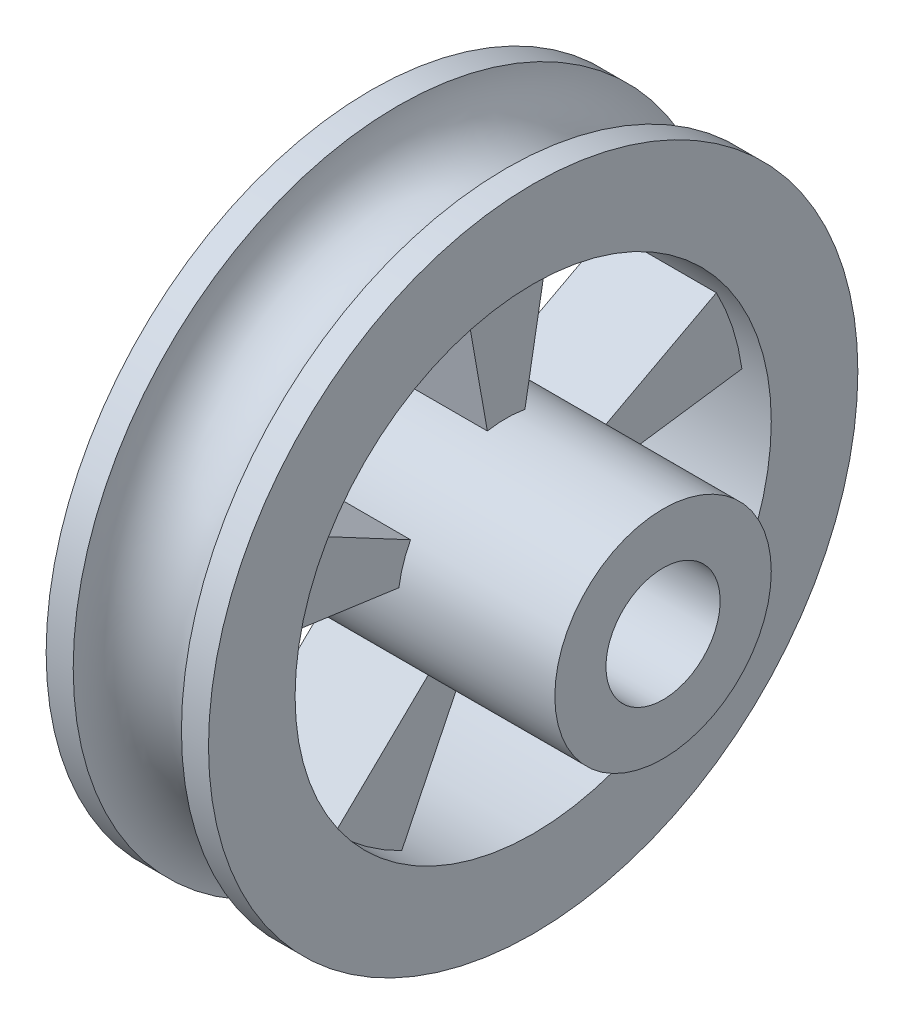
ISO-10303-21;
HEADER;
FILE_DESCRIPTION(('STEP AP214'),'2;1');
FILE_NAME('part.step','',(''),(''),'','','');
FILE_SCHEMA(('AUTOMOTIVE_DESIGN { 1 0 10303 214 1 1 1 1 }'));
ENDSEC;
DATA;
#1=APPLICATION_CONTEXT('core data for automotive mechanical design processes');
#2=APPLICATION_PROTOCOL_DEFINITION('international standard','automotive_design',2000,#1);
#3=PRODUCT_CONTEXT('',#1,'mechanical');
#4=PRODUCT('Part','Part','',(#3));
#5=PRODUCT_RELATED_PRODUCT_CATEGORY('part','',(#4));
#6=PRODUCT_DEFINITION_FORMATION('','',#4);
#7=PRODUCT_DEFINITION_CONTEXT('part definition',#1,'design');
#8=PRODUCT_DEFINITION('design','',#6,#7);
#9=PRODUCT_DEFINITION_SHAPE('','',#8);
#10=(LENGTH_UNIT() NAMED_UNIT(*) SI_UNIT(.MILLI.,.METRE.));
#11=(NAMED_UNIT(*) PLANE_ANGLE_UNIT() SI_UNIT($,.RADIAN.));
#12=(NAMED_UNIT(*) SI_UNIT($,.STERADIAN.) SOLID_ANGLE_UNIT());
#13=UNCERTAINTY_MEASURE_WITH_UNIT(LENGTH_MEASURE(1.E-05),#10,'distance_accuracy_value','');
#14=(GEOMETRIC_REPRESENTATION_CONTEXT(3) GLOBAL_UNCERTAINTY_ASSIGNED_CONTEXT((#13)) GLOBAL_UNIT_ASSIGNED_CONTEXT((#10,
#11,#12)) REPRESENTATION_CONTEXT('',''));
#15=CARTESIAN_POINT('',(0.,0.,0.));
#16=DIRECTION('',(0.,0.,1.));
#17=DIRECTION('',(1.,0.,0.));
#18=AXIS2_PLACEMENT_3D('',#15,#16,#17);
#19=CARTESIAN_POINT('',(-4.7625,0.,0.));
#20=DIRECTION('',(1.,0.,0.));
#21=DIRECTION('',(0.,0.,-1.));
#22=AXIS2_PLACEMENT_3D('',#19,#20,#21);
#23=CYLINDRICAL_SURFACE('',#22,9.525);
#24=CARTESIAN_POINT('',(-0.793749999999999,0.,0.));
#25=DIRECTION('',(-1.,0.,0.));
#26=DIRECTION('',(0.,0.,1.));
#27=AXIS2_PLACEMENT_3D('',#24,#25,#26);
#28=CIRCLE('',#27,9.525);
#29=CARTESIAN_POINT('',(-0.793749999999999,0.,-9.525));
#30=VERTEX_POINT('',#29);
#31=EDGE_CURVE('E47',#30,#30,#28,.F.);
#32=CARTESIAN_POINT('',(0.,0.,0.));
#33=DIRECTION('',(-1.,0.,0.));
#34=DIRECTION('',(0.,0.,1.));
#35=AXIS2_PLACEMENT_3D('',#32,#33,#34);
#36=CIRCLE('',#35,9.525);
#37=CARTESIAN_POINT('',(0.,0.,-9.525));
#38=VERTEX_POINT('',#37);
#39=EDGE_CURVE('E318',#38,#38,#36,.T.);
#40=CARTESIAN_POINT('',(-0.793749999999999,0.,-9.525));
#41=CARTESIAN_POINT('',(-0.785481770833333,0.,-9.525));
#42=CARTESIAN_POINT('',(-0.777213541666666,0.,-9.525));
#43=CARTESIAN_POINT('',(-0.760677083333333,0.,-9.525));
#44=CARTESIAN_POINT('',(-0.752408854166666,0.,-9.525));
#45=CARTESIAN_POINT('',(-0.735872395833333,0.,-9.525));
#46=CARTESIAN_POINT('',(-0.727604166666666,0.,-9.525));
#47=CARTESIAN_POINT('',(-0.711067708333333,0.,-9.525));
#48=CARTESIAN_POINT('',(-0.702799479166666,0.,-9.525));
#49=CARTESIAN_POINT('',(-0.686263020833333,0.,-9.525));
#50=CARTESIAN_POINT('',(-0.677994791666666,0.,-9.525));
#51=CARTESIAN_POINT('',(-0.661458333333333,0.,-9.525));
#52=CARTESIAN_POINT('',(-0.653190104166666,0.,-9.525));
#53=CARTESIAN_POINT('',(-0.636653645833333,0.,-9.525));
#54=CARTESIAN_POINT('',(-0.628385416666666,0.,-9.525));
#55=CARTESIAN_POINT('',(-0.611848958333333,0.,-9.525));
#56=CARTESIAN_POINT('',(-0.603580729166666,0.,-9.525));
#57=CARTESIAN_POINT('',(-0.587044270833333,0.,-9.525));
#58=CARTESIAN_POINT('',(-0.578776041666666,0.,-9.525));
#59=CARTESIAN_POINT('',(-0.562239583333333,0.,-9.525));
#60=CARTESIAN_POINT('',(-0.553971354166666,0.,-9.525));
#61=CARTESIAN_POINT('',(-0.537434895833333,0.,-9.525));
#62=CARTESIAN_POINT('',(-0.529166666666666,0.,-9.525));
#63=CARTESIAN_POINT('',(-0.512630208333333,0.,-9.525));
#64=CARTESIAN_POINT('',(-0.504361979166666,0.,-9.525));
#65=CARTESIAN_POINT('',(-0.487825520833333,0.,-9.525));
#66=CARTESIAN_POINT('',(-0.479557291666666,0.,-9.525));
#67=CARTESIAN_POINT('',(-0.463020833333333,0.,-9.525));
#68=CARTESIAN_POINT('',(-0.454752604166666,0.,-9.525));
#69=CARTESIAN_POINT('',(-0.438216145833333,0.,-9.525));
#70=CARTESIAN_POINT('',(-0.429947916666666,0.,-9.525));
#71=CARTESIAN_POINT('',(-0.413411458333333,0.,-9.525));
#72=CARTESIAN_POINT('',(-0.405143229166666,0.,-9.525));
#73=CARTESIAN_POINT('',(-0.388606770833333,0.,-9.525));
#74=CARTESIAN_POINT('',(-0.380338541666666,0.,-9.525));
#75=CARTESIAN_POINT('',(-0.363802083333333,0.,-9.525));
#76=CARTESIAN_POINT('',(-0.355533854166666,0.,-9.525));
#77=CARTESIAN_POINT('',(-0.338997395833333,0.,-9.525));
#78=CARTESIAN_POINT('',(-0.330729166666666,0.,-9.525));
#79=CARTESIAN_POINT('',(-0.314192708333333,0.,-9.525));
#80=CARTESIAN_POINT('',(-0.305924479166667,0.,-9.525));
#81=CARTESIAN_POINT('',(-0.289388020833333,0.,-9.525));
#82=CARTESIAN_POINT('',(-0.281119791666667,0.,-9.525));
#83=CARTESIAN_POINT('',(-0.264583333333333,0.,-9.525));
#84=CARTESIAN_POINT('',(-0.256315104166666,0.,-9.525));
#85=CARTESIAN_POINT('',(-0.239778645833333,0.,-9.525));
#86=CARTESIAN_POINT('',(-0.231510416666667,0.,-9.525));
#87=CARTESIAN_POINT('',(-0.214973958333333,0.,-9.525));
#88=CARTESIAN_POINT('',(-0.206705729166667,0.,-9.525));
#89=CARTESIAN_POINT('',(-0.190169270833333,0.,-9.525));
#90=CARTESIAN_POINT('',(-0.181901041666666,0.,-9.525));
#91=CARTESIAN_POINT('',(-0.165364583333333,0.,-9.525));
#92=CARTESIAN_POINT('',(-0.157096354166667,0.,-9.525));
#93=CARTESIAN_POINT('',(-0.140559895833333,0.,-9.525));
#94=CARTESIAN_POINT('',(-0.132291666666667,0.,-9.525));
#95=CARTESIAN_POINT('',(-0.115755208333333,0.,-9.525));
#96=CARTESIAN_POINT('',(-0.107486979166666,0.,-9.525));
#97=CARTESIAN_POINT('',(-0.090950520833333,0.,-9.525));
#98=CARTESIAN_POINT('',(-0.0826822916666665,0.,-9.525));
#99=CARTESIAN_POINT('',(-0.0661458333333333,0.,-9.525));
#100=CARTESIAN_POINT('',(-0.0578776041666665,0.,-9.525));
#101=CARTESIAN_POINT('',(-0.0413411458333333,0.,-9.525));
#102=CARTESIAN_POINT('',(-0.0330729166666668,0.,-9.525));
#103=CARTESIAN_POINT('',(-0.0165364583333335,0.,-9.525));
#104=CARTESIAN_POINT('',(-0.00826822916666677,0.,-9.525));
#105=CARTESIAN_POINT('',(0.,0.,-9.525));
#106=B_SPLINE_CURVE_WITH_KNOTS('',3,(#40,#41,#42,#43,#44,#45,#46,#47,#48,#49,#50,#51,#52,#53,
#54,#55,#56,#57,#58,#59,#60,#61,#62,#63,#64,#65,#66,#67,#68,#69,#70,#71,#72,#73,#74,#75,#76,#77,
#78,#79,#80,#81,#82,#83,#84,#85,#86,#87,#88,#89,#90,#91,#92,#93,#94,#95,#96,#97,#98,#99,#100,
#101,#102,#103,#104,#105),.UNSPECIFIED.,.F.,.F.,(4,2,2,2,2,2,2,2,2,2,2,2,2,2,2,2,2,2,2,2,2,2,2,
2,2,2,2,2,2,2,2,2,4),(0.,0.0248046875000003,0.0496093749999997,0.0744140625,0.0992187499999995,
0.1240234375,0.148828125,0.1736328125,0.1984375,0.2232421875,0.248046875,0.2728515625,
0.29765625,0.3224609375,0.347265625,0.372070312499999,0.396875,0.4216796875,0.446484374999999,
0.4712890625,0.496093749999999,0.520898437499999,0.545703125,0.570507812499999,
0.595312499999999,0.6201171875,0.644921874999999,0.6697265625,0.69453125,0.719335937499999,
0.744140625,0.768945312499999,0.793749999999999),.UNSPECIFIED.);
#107=EDGE_CURVE('BSEAM43',#30,#38,#106,.T.);
#108=ORIENTED_EDGE('',*,*,#31,.T.);
#109=ORIENTED_EDGE('',*,*,#39,.T.);
#110=ORIENTED_EDGE('',*,*,#107,.T.);
#111=ORIENTED_EDGE('',*,*,#107,.F.);
#112=EDGE_LOOP('',(#108,#110,#109,#111));
#113=FACE_BOUND('',#112,.T.);
#114=ADVANCED_FACE('F43',(#113),#23,.T.);
#115=CARTESIAN_POINT('',(3.81,0.,0.));
#116=DIRECTION('',(-1.,0.,0.));
#117=DIRECTION('',(0.,0.,1.));
#118=AXIS2_PLACEMENT_3D('',#115,#116,#117);
#119=CYLINDRICAL_SURFACE('',#118,3.175);
#120=DIRECTION('',(-1.,0.,0.));
#121=VECTOR('',#120,1.);
#122=CARTESIAN_POINT('',(3.81,0.441874595548242,3.14410111825448));
#123=LINE('',#122,#121);
#124=CARTESIAN_POINT('',(-0.79375,0.441874595548242,3.14410111825448));
#125=VERTEX_POINT('',#124);
#126=CARTESIAN_POINT('',(-3.96875,0.441874595548242,3.14410111825448));
#127=VERTEX_POINT('',#126);
#128=EDGE_CURVE('E65',#125,#127,#123,.T.);
#129=ORIENTED_EDGE('',*,*,#128,.T.);
#130=CARTESIAN_POINT('',(-3.96875,0.,0.));
#131=DIRECTION('',(-1.,0.,0.));
#132=DIRECTION('',(0.,0.,1.));
#133=AXIS2_PLACEMENT_3D('',#130,#131,#132);
#134=CIRCLE('',#133,3.175);
#135=CARTESIAN_POINT('',(-3.96875,1.49057221184524,2.80335860732707));
#136=VERTEX_POINT('',#135);
#137=EDGE_CURVE('E60',#127,#136,#134,.T.);
#138=ORIENTED_EDGE('',*,*,#137,.T.);
#139=DIRECTION('',(-1.,0.,0.));
#140=VECTOR('',#139,1.);
#141=CARTESIAN_POINT('',(3.81,1.49057221184524,2.80335860732707));
#142=LINE('',#141,#140);
#143=CARTESIAN_POINT('',(-0.79375,1.49057221184524,2.80335860732707));
#144=VERTEX_POINT('',#143);
#145=EDGE_CURVE('E218',#136,#144,#142,.F.);
#146=ORIENTED_EDGE('',*,*,#145,.T.);
#147=CARTESIAN_POINT('',(-0.79375,0.,0.));
#148=DIRECTION('',(-1.,0.,0.));
#149=DIRECTION('',(0.,0.,1.));
#150=AXIS2_PLACEMENT_3D('',#147,#148,#149);
#151=CIRCLE('',#150,3.175);
#152=EDGE_CURVE('E197',#125,#144,#151,.T.);
#153=ORIENTED_EDGE('',*,*,#152,.F.);
#154=EDGE_LOOP('',(#129,#138,#146,#153));
#155=FACE_BOUND('',#154,.T.);
#156=DIRECTION('',(-1.,0.,0.));
#157=VECTOR('',#156,1.);
#158=CARTESIAN_POINT('',(3.81,-2.85367109699984,1.39182839105534));
#159=LINE('',#158,#157);
#160=CARTESIAN_POINT('',(-0.79375,-2.85367109699984,1.39182839105534));
#161=VERTEX_POINT('',#160);
#162=CARTESIAN_POINT('',(-3.96875,-2.85367109699984,1.39182839105534));
#163=VERTEX_POINT('',#162);
#164=EDGE_CURVE('E247',#161,#163,#159,.T.);
#165=ORIENTED_EDGE('',*,*,#164,.T.);
#166=CARTESIAN_POINT('',(-3.96875,0.,0.));
#167=DIRECTION('',(-1.,0.,0.));
#168=DIRECTION('',(0.,0.,1.));
#169=AXIS2_PLACEMENT_3D('',#166,#167,#168);
#170=CIRCLE('',#169,3.175);
#171=CARTESIAN_POINT('',(-3.96875,-2.20554032620729,2.28390386607524));
#172=VERTEX_POINT('',#171);
#173=EDGE_CURVE('E245',#163,#172,#170,.T.);
#174=ORIENTED_EDGE('',*,*,#173,.T.);
#175=DIRECTION('',(-1.,0.,0.));
#176=VECTOR('',#175,1.);
#177=CARTESIAN_POINT('',(3.81,-2.20554032620729,2.28390386607524));
#178=LINE('',#177,#176);
#179=CARTESIAN_POINT('',(-0.79375,-2.20554032620729,2.28390386607524));
#180=VERTEX_POINT('',#179);
#181=EDGE_CURVE('E249',#172,#180,#178,.F.);
#182=ORIENTED_EDGE('',*,*,#181,.T.);
#183=CARTESIAN_POINT('',(-0.79375,0.,0.));
#184=DIRECTION('',(-1.,0.,0.));
#185=DIRECTION('',(0.,0.,1.));
#186=AXIS2_PLACEMENT_3D('',#183,#184,#185);
#187=CIRCLE('',#186,3.175);
#188=EDGE_CURVE('E242',#161,#180,#187,.T.);
#189=ORIENTED_EDGE('',*,*,#188,.F.);
#190=EDGE_LOOP('',(#165,#174,#182,#189));
#191=FACE_BOUND('',#190,.T.);
#192=DIRECTION('',(-1.,0.,0.));
#193=VECTOR('',#192,1.);
#194=CARTESIAN_POINT('',(3.81,-2.20554032620733,-2.2839038660752));
#195=LINE('',#194,#193);
#196=CARTESIAN_POINT('',(-0.79375,-2.20554032620733,-2.28390386607521));
#197=VERTEX_POINT('',#196);
#198=CARTESIAN_POINT('',(-3.96875,-2.20554032620733,-2.2839038660752));
#199=VERTEX_POINT('',#198);
#200=EDGE_CURVE('E278',#197,#199,#195,.T.);
#201=ORIENTED_EDGE('',*,*,#200,.T.);
#202=CARTESIAN_POINT('',(-3.96875,0.,0.));
#203=DIRECTION('',(-1.,0.,0.));
#204=DIRECTION('',(0.,0.,1.));
#205=AXIS2_PLACEMENT_3D('',#202,#203,#204);
#206=CIRCLE('',#205,3.175);
#207=CARTESIAN_POINT('',(-3.96875,-2.85367109699986,-1.3918283910553));
#208=VERTEX_POINT('',#207);
#209=EDGE_CURVE('E276',#199,#208,#206,.T.);
#210=ORIENTED_EDGE('',*,*,#209,.T.);
#211=DIRECTION('',(-1.,0.,0.));
#212=VECTOR('',#211,1.);
#213=CARTESIAN_POINT('',(3.81,-2.85367109699986,-1.3918283910553));
#214=LINE('',#213,#212);
#215=CARTESIAN_POINT('',(-0.79375,-2.85367109699986,-1.3918283910553));
#216=VERTEX_POINT('',#215);
#217=EDGE_CURVE('E280',#208,#216,#214,.F.);
#218=ORIENTED_EDGE('',*,*,#217,.T.);
#219=CARTESIAN_POINT('',(-0.79375,0.,0.));
#220=DIRECTION('',(-1.,0.,0.));
#221=DIRECTION('',(0.,0.,1.));
#222=AXIS2_PLACEMENT_3D('',#219,#220,#221);
#223=CIRCLE('',#222,3.175);
#224=EDGE_CURVE('E255',#197,#216,#223,.T.);
#225=ORIENTED_EDGE('',*,*,#224,.F.);
#226=EDGE_LOOP('',(#201,#210,#218,#225));
#227=FACE_BOUND('',#226,.T.);
#228=DIRECTION('',(-1.,0.,0.));
#229=VECTOR('',#228,1.);
#230=CARTESIAN_POINT('',(3.81,1.4905722118452,-2.8033586073271));
#231=LINE('',#230,#229);
#232=CARTESIAN_POINT('',(-0.79375,1.4905722118452,-2.8033586073271));
#233=VERTEX_POINT('',#232);
#234=CARTESIAN_POINT('',(-3.96875,1.4905722118452,-2.8033586073271));
#235=VERTEX_POINT('',#234);
#236=EDGE_CURVE('E309',#233,#235,#231,.T.);
#237=ORIENTED_EDGE('',*,*,#236,.T.);
#238=CARTESIAN_POINT('',(-3.96875,0.,0.));
#239=DIRECTION('',(-1.,0.,0.));
#240=DIRECTION('',(0.,0.,1.));
#241=AXIS2_PLACEMENT_3D('',#238,#239,#240);
#242=CIRCLE('',#241,3.175);
#243=CARTESIAN_POINT('',(-3.96875,0.441874595548196,-3.14410111825449));
#244=VERTEX_POINT('',#243);
#245=EDGE_CURVE('E307',#235,#244,#242,.T.);
#246=ORIENTED_EDGE('',*,*,#245,.T.);
#247=DIRECTION('',(-1.,0.,0.));
#248=VECTOR('',#247,1.);
#249=CARTESIAN_POINT('',(3.81,0.441874595548196,-3.14410111825449));
#250=LINE('',#249,#248);
#251=CARTESIAN_POINT('',(-0.79375,0.441874595548196,-3.14410111825449));
#252=VERTEX_POINT('',#251);
#253=EDGE_CURVE('E311',#244,#252,#250,.F.);
#254=ORIENTED_EDGE('',*,*,#253,.T.);
#255=CARTESIAN_POINT('',(-0.79375,0.,0.));
#256=DIRECTION('',(-1.,0.,0.));
#257=DIRECTION('',(0.,0.,1.));
#258=AXIS2_PLACEMENT_3D('',#255,#256,#257);
#259=CIRCLE('',#258,3.175);
#260=EDGE_CURVE('E304',#233,#252,#259,.T.);
#261=ORIENTED_EDGE('',*,*,#260,.F.);
#262=EDGE_LOOP('',(#237,#246,#254,#261));
#263=FACE_BOUND('',#262,.T.);
#264=DIRECTION('',(-1.,0.,0.));
#265=VECTOR('',#264,1.);
#266=CARTESIAN_POINT('',(3.81,3.12676461581376,0.551332964092505));
#267=LINE('',#266,#265);
#268=CARTESIAN_POINT('',(-0.79375,3.12676461581376,0.551332964092505));
#269=VERTEX_POINT('',#268);
#270=CARTESIAN_POINT('',(-3.96875,3.12676461581376,0.551332964092505));
#271=VERTEX_POINT('',#270);
#272=EDGE_CURVE('E357',#269,#271,#267,.T.);
#273=ORIENTED_EDGE('',*,*,#272,.T.);
#274=CARTESIAN_POINT('',(-3.96875,0.,0.));
#275=DIRECTION('',(-1.,0.,0.));
#276=DIRECTION('',(0.,0.,1.));
#277=AXIS2_PLACEMENT_3D('',#274,#275,#276);
#278=CIRCLE('',#277,3.175);
#279=CARTESIAN_POINT('',(-3.96875,3.12676461581376,-0.551332964092507));
#280=VERTEX_POINT('',#279);
#281=EDGE_CURVE('E13',#271,#280,#278,.T.);
#282=ORIENTED_EDGE('',*,*,#281,.T.);
#283=DIRECTION('',(-1.,0.,0.));
#284=VECTOR('',#283,1.);
#285=CARTESIAN_POINT('',(3.81,3.12676461581376,-0.551332964092507));
#286=LINE('',#285,#284);
#287=CARTESIAN_POINT('',(-0.79375,3.12676461581376,-0.551332964092507));
#288=VERTEX_POINT('',#287);
#289=EDGE_CURVE('E52',#280,#288,#286,.F.);
#290=ORIENTED_EDGE('',*,*,#289,.T.);
#291=CARTESIAN_POINT('',(-0.79375,0.,0.));
#292=DIRECTION('',(-1.,0.,0.));
#293=DIRECTION('',(0.,0.,1.));
#294=AXIS2_PLACEMENT_3D('',#291,#292,#293);
#295=CIRCLE('',#294,3.175);
#296=EDGE_CURVE('E354',#269,#288,#295,.T.);
#297=ORIENTED_EDGE('',*,*,#296,.F.);
#298=EDGE_LOOP('',(#273,#282,#290,#297));
#299=FACE_BOUND('',#298,.T.);
#300=CARTESIAN_POINT('',(3.81,0.,0.));
#301=DIRECTION('',(1.,0.,0.));
#302=DIRECTION('',(0.,0.,-1.));
#303=AXIS2_PLACEMENT_3D('',#300,#301,#302);
#304=CIRCLE('',#303,3.175);
#305=CARTESIAN_POINT('',(3.81,0.,-3.175));
#306=VERTEX_POINT('',#305);
#307=EDGE_CURVE('E351',#306,#306,#304,.T.);
#308=ORIENTED_EDGE('',*,*,#307,.F.);
#309=EDGE_LOOP('',(#308));
#310=FACE_BOUND('',#309,.T.);
#311=CARTESIAN_POINT('',(-4.7625,0.,0.));
#312=DIRECTION('',(-1.,0.,0.));
#313=DIRECTION('',(0.,0.,1.));
#314=AXIS2_PLACEMENT_3D('',#311,#312,#313);
#315=CIRCLE('',#314,3.175);
#316=CARTESIAN_POINT('',(-4.7625,0.,3.175));
#317=VERTEX_POINT('',#316);
#318=EDGE_CURVE('E348',#317,#317,#315,.T.);
#319=ORIENTED_EDGE('',*,*,#318,.F.);
#320=EDGE_LOOP('',(#319));
#321=FACE_BOUND('',#320,.T.);
#322=ADVANCED_FACE('F45',(#155,#191,#227,#263,#299,#310,#321),#119,.T.);
#323=CARTESIAN_POINT('',(3.81,0.,0.));
#324=DIRECTION('',(1.,0.,0.));
#325=DIRECTION('',(0.,0.,-1.));
#326=AXIS2_PLACEMENT_3D('',#323,#324,#325);
#327=PLANE('',#326);
#328=CARTESIAN_POINT('',(3.81,0.,0.));
#329=DIRECTION('',(-1.,0.,0.));
#330=DIRECTION('',(0.,0.,1.));
#331=AXIS2_PLACEMENT_3D('',#328,#329,#330);
#332=CIRCLE('',#331,1.675);
#333=CARTESIAN_POINT('',(3.81,0.,1.675));
#334=VERTEX_POINT('',#333);
#335=EDGE_CURVE('E361',#334,#334,#332,.T.);
#336=ORIENTED_EDGE('',*,*,#335,.T.);
#337=EDGE_LOOP('',(#336));
#338=FACE_BOUND('',#337,.T.);
#339=ORIENTED_EDGE('',*,*,#307,.T.);
#340=EDGE_LOOP('',(#339));
#341=FACE_BOUND('',#340,.T.);
#342=ADVANCED_FACE('F379',(#338,#341),#327,.T.);
#343=CARTESIAN_POINT('',(-4.7625,0.,0.));
#344=DIRECTION('',(-1.,0.,0.));
#345=DIRECTION('',(0.,0.,1.));
#346=AXIS2_PLACEMENT_3D('',#343,#344,#345);
#347=PLANE('',#346);
#348=CARTESIAN_POINT('',(-4.7625,0.,0.));
#349=DIRECTION('',(-1.,0.,0.));
#350=DIRECTION('',(0.,0.,1.));
#351=AXIS2_PLACEMENT_3D('',#348,#349,#350);
#352=CIRCLE('',#351,1.675);
#353=CARTESIAN_POINT('',(-4.7625,0.,1.675));
#354=VERTEX_POINT('',#353);
#355=EDGE_CURVE('E366',#354,#354,#352,.T.);
#356=ORIENTED_EDGE('',*,*,#355,.F.);
#357=EDGE_LOOP('',(#356));
#358=FACE_BOUND('',#357,.T.);
#359=ORIENTED_EDGE('',*,*,#318,.T.);
#360=EDGE_LOOP('',(#359));
#361=FACE_BOUND('',#360,.T.);
#362=ADVANCED_FACE('F375',(#358,#361),#347,.T.);
#363=CARTESIAN_POINT('',(7.39425765050365,0.,0.));
#364=DIRECTION('',(0.,-0.173648177666931,-0.984807753012208));
#365=DIRECTION('',(0.,0.984807753012208,-0.173648177666931));
#366=AXIS2_PLACEMENT_3D('',#363,#364,#365);
#367=PLANE('',#366);
#368=ORIENTED_EDGE('',*,*,#289,.F.);
#369=DIRECTION('',(0.,-0.984807753012208,0.173648177666931));
#370=VECTOR('',#369,1.);
#371=CARTESIAN_POINT('',(-3.96875,0.,0.));
#372=LINE('',#371,#370);
#373=CARTESIAN_POINT('',(-3.96875,6.87888215479027,-1.21293252100351));
#374=VERTEX_POINT('',#373);
#375=EDGE_CURVE('E321',#374,#280,#372,.T.);
#376=ORIENTED_EDGE('',*,*,#375,.F.);
#377=DIRECTION('',(-1.,0.,0.));
#378=VECTOR('',#377,1.);
#379=CARTESIAN_POINT('',(7.39425765050365,6.87888215479027,-1.21293252100352));
#380=LINE('',#379,#378);
#381=CARTESIAN_POINT('',(-0.79375,6.87888215479027,-1.21293252100352));
#382=VERTEX_POINT('',#381);
#383=EDGE_CURVE('E330',#382,#374,#380,.T.);
#384=ORIENTED_EDGE('',*,*,#383,.F.);
#385=DIRECTION('',(0.,0.984807753012208,-0.173648177666931));
#386=VECTOR('',#385,1.);
#387=CARTESIAN_POINT('',(-0.793749999999999,0.,0.));
#388=LINE('',#387,#386);
#389=EDGE_CURVE('E329',#288,#382,#388,.T.);
#390=ORIENTED_EDGE('',*,*,#389,.F.);
#391=EDGE_LOOP('',(#368,#376,#384,#390));
#392=FACE_BOUND('',#391,.T.);
#393=ADVANCED_FACE('F378',(#392),#367,.T.);
#394=CARTESIAN_POINT('',(7.39425765050365,0.,0.));
#395=DIRECTION('',(0.,-0.173648177666931,0.984807753012208));
#396=DIRECTION('',(0.,-0.984807753012208,-0.173648177666931));
#397=AXIS2_PLACEMENT_3D('',#394,#395,#396);
#398=PLANE('',#397);
#399=ORIENTED_EDGE('',*,*,#272,.F.);
#400=DIRECTION('',(0.,-0.984807753012208,-0.173648177666931));
#401=VECTOR('',#400,1.);
#402=CARTESIAN_POINT('',(-0.793749999999999,0.,0.));
#403=LINE('',#402,#401);
#404=CARTESIAN_POINT('',(-0.793749999999999,6.87888215479027,1.21293252100351));
#405=VERTEX_POINT('',#404);
#406=EDGE_CURVE('E333',#405,#269,#403,.T.);
#407=ORIENTED_EDGE('',*,*,#406,.F.);
#408=DIRECTION('',(-1.,0.,0.));
#409=VECTOR('',#408,1.);
#410=CARTESIAN_POINT('',(7.39425765050365,6.87888215479027,1.21293252100351));
#411=LINE('',#410,#409);
#412=CARTESIAN_POINT('',(-3.96875,6.87888215479027,1.21293252100351));
#413=VERTEX_POINT('',#412);
#414=EDGE_CURVE('E342',#405,#413,#411,.T.);
#415=ORIENTED_EDGE('',*,*,#414,.T.);
#416=DIRECTION('',(0.,0.984807753012208,0.173648177666931));
#417=VECTOR('',#416,1.);
#418=CARTESIAN_POINT('',(-3.96875,0.,0.));
#419=LINE('',#418,#417);
#420=EDGE_CURVE('E336',#271,#413,#419,.T.);
#421=ORIENTED_EDGE('',*,*,#420,.F.);
#422=EDGE_LOOP('',(#399,#407,#415,#421));
#423=FACE_BOUND('',#422,.T.);
#424=ADVANCED_FACE('F413',(#423),#398,.T.);
#425=CARTESIAN_POINT('',(-3.96875,0.,0.));
#426=DIRECTION('',(-1.,0.,0.));
#427=DIRECTION('',(0.,0.,1.));
#428=AXIS2_PLACEMENT_3D('',#425,#426,#427);
#429=PLANE('',#428);
#430=ORIENTED_EDGE('',*,*,#281,.F.);
#431=ORIENTED_EDGE('',*,*,#420,.T.);
#432=CARTESIAN_POINT('',(-3.96875,0.,0.));
#433=DIRECTION('',(-1.,0.,0.));
#434=DIRECTION('',(0.,0.,1.));
#435=AXIS2_PLACEMENT_3D('',#432,#433,#434);
#436=CIRCLE('',#435,6.985);
#437=EDGE_CURVE('E339',#413,#374,#436,.T.);
#438=ORIENTED_EDGE('',*,*,#437,.T.);
#439=ORIENTED_EDGE('',*,*,#375,.T.);
#440=EDGE_LOOP('',(#430,#431,#438,#439));
#441=FACE_BOUND('',#440,.T.);
#442=ADVANCED_FACE('F411',(#441),#429,.T.);
#443=CARTESIAN_POINT('',(-0.79375,0.,0.));
#444=DIRECTION('',(-1.,0.,0.));
#445=DIRECTION('',(0.,0.,1.));
#446=AXIS2_PLACEMENT_3D('',#443,#444,#445);
#447=PLANE('',#446);
#448=ORIENTED_EDGE('',*,*,#406,.T.);
#449=ORIENTED_EDGE('',*,*,#296,.T.);
#450=ORIENTED_EDGE('',*,*,#389,.T.);
#451=CARTESIAN_POINT('',(-0.793749999999999,0.,0.));
#452=DIRECTION('',(-1.,0.,0.));
#453=DIRECTION('',(0.,0.,1.));
#454=AXIS2_PLACEMENT_3D('',#451,#452,#453);
#455=CIRCLE('',#454,6.985);
#456=EDGE_CURVE('E326',#382,#405,#455,.F.);
#457=ORIENTED_EDGE('',*,*,#456,.T.);
#458=EDGE_LOOP('',(#448,#449,#450,#457));
#459=FACE_BOUND('',#458,.T.);
#460=ADVANCED_FACE('F417',(#459),#447,.F.);
#461=CARTESIAN_POINT('',(-4.7625,0.,0.));
#462=DIRECTION('',(1.,0.,0.));
#463=DIRECTION('',(0.,0.,-1.));
#464=AXIS2_PLACEMENT_3D('',#461,#462,#463);
#465=CYLINDRICAL_SURFACE('',#464,6.985);
#466=CARTESIAN_POINT('',(-3.96875,0.,0.));
#467=DIRECTION('',(-1.,0.,0.));
#468=DIRECTION('',(0.,-0.95105651629515,0.309016994374958));
#469=AXIS2_PLACEMENT_3D('',#466,#467,#468);
#470=CIRCLE('',#469,6.985);
#471=CARTESIAN_POINT('',(-3.96875,0.972124110206133,6.91702246015986));
#472=VERTEX_POINT('',#471);
#473=CARTESIAN_POINT('',(-3.96875,3.27925886605952,6.16738893611957));
#474=VERTEX_POINT('',#473);
#475=EDGE_CURVE('E202',#472,#474,#470,.T.);
#476=ORIENTED_EDGE('',*,*,#475,.F.);
#477=DIRECTION('',(-1.,0.,0.));
#478=VECTOR('',#477,1.);
#479=CARTESIAN_POINT('',(7.65498128181813,0.972124110206133,6.91702246015986));
#480=LINE('',#479,#478);
#481=CARTESIAN_POINT('',(-0.793749999999999,0.972124110206133,6.91702246015986));
#482=VERTEX_POINT('',#481);
#483=EDGE_CURVE('E195',#482,#472,#480,.T.);
#484=ORIENTED_EDGE('',*,*,#483,.F.);
#485=CARTESIAN_POINT('',(-0.793749999999999,0.,0.));
#486=DIRECTION('',(-1.,0.,0.));
#487=DIRECTION('',(0.,0.,1.));
#488=AXIS2_PLACEMENT_3D('',#485,#486,#487);
#489=CIRCLE('',#488,6.985);
#490=CARTESIAN_POINT('',(-0.79375,3.27925886605952,6.16738893611957));
#491=VERTEX_POINT('',#490);
#492=EDGE_CURVE('E180',#491,#482,#489,.F.);
#493=ORIENTED_EDGE('',*,*,#492,.F.);
#494=DIRECTION('',(-1.,0.,0.));
#495=VECTOR('',#494,1.);
#496=CARTESIAN_POINT('',(7.65498128181813,3.27925886605952,6.16738893611957));
#497=LINE('',#496,#495);
#498=EDGE_CURVE('E204',#491,#474,#497,.T.);
#499=ORIENTED_EDGE('',*,*,#498,.T.);
#500=EDGE_LOOP('',(#476,#484,#493,#499));
#501=FACE_BOUND('',#500,.T.);
#502=CARTESIAN_POINT('',(-3.96875,0.,0.));
#503=DIRECTION('',(-1.,0.,0.));
#504=DIRECTION('',(0.,-0.58778525229248,-0.809016994374942));
#505=AXIS2_PLACEMENT_3D('',#502,#503,#504);
#506=CIRCLE('',#505,6.985);
#507=CARTESIAN_POINT('',(-3.96875,-6.27807641339966,3.06202246032176));
#508=VERTEX_POINT('',#507);
#509=CARTESIAN_POINT('',(-3.96875,-4.85218871765605,5.02458850536553));
#510=VERTEX_POINT('',#509);
#511=EDGE_CURVE('E227',#508,#510,#506,.T.);
#512=ORIENTED_EDGE('',*,*,#511,.F.);
#513=DIRECTION('',(-1.,0.,0.));
#514=VECTOR('',#513,1.);
#515=CARTESIAN_POINT('',(8.04118978141521,-6.27807641339966,3.06202246032176));
#516=LINE('',#515,#514);
#517=CARTESIAN_POINT('',(-0.793749999999996,-6.27807641339966,3.06202246032176));
#518=VERTEX_POINT('',#517);
#519=EDGE_CURVE('E232',#518,#508,#516,.T.);
#520=ORIENTED_EDGE('',*,*,#519,.F.);
#521=CARTESIAN_POINT('',(-0.793749999999999,0.,0.));
#522=DIRECTION('',(-1.,0.,0.));
#523=DIRECTION('',(0.,0.,1.));
#524=AXIS2_PLACEMENT_3D('',#521,#522,#523);
#525=CIRCLE('',#524,6.985);
#526=CARTESIAN_POINT('',(-0.79375,-4.85218871765605,5.02458850536553));
#527=VERTEX_POINT('',#526);
#528=EDGE_CURVE('E221',#527,#518,#525,.F.);
#529=ORIENTED_EDGE('',*,*,#528,.F.);
#530=DIRECTION('',(-1.,0.,0.));
#531=VECTOR('',#530,1.);
#532=CARTESIAN_POINT('',(8.04118978141521,-4.85218871765605,5.02458850536553));
#533=LINE('',#532,#531);
#534=EDGE_CURVE('E220',#527,#510,#533,.T.);
#535=ORIENTED_EDGE('',*,*,#534,.T.);
#536=EDGE_LOOP('',(#512,#520,#529,#535));
#537=FACE_BOUND('',#536,.T.);
#538=CARTESIAN_POINT('',(-3.96875,0.,0.));
#539=DIRECTION('',(-1.,0.,0.));
#540=DIRECTION('',(0.,0.587785252292469,-0.809016994374951));
#541=AXIS2_PLACEMENT_3D('',#538,#539,#540);
#542=CIRCLE('',#541,6.985);
#543=CARTESIAN_POINT('',(-3.96875,-4.85218871765612,-5.02458850536545));
#544=VERTEX_POINT('',#543);
#545=CARTESIAN_POINT('',(-3.96875,-6.2780764133997,-3.06202246032166));
#546=VERTEX_POINT('',#545);
#547=EDGE_CURVE('E263',#544,#546,#542,.T.);
#548=ORIENTED_EDGE('',*,*,#547,.F.);
#549=DIRECTION('',(-1.,0.,0.));
#550=VECTOR('',#549,1.);
#551=CARTESIAN_POINT('',(8.0411897814152,-4.85218871765612,-5.02458850536545));
#552=LINE('',#551,#550);
#553=CARTESIAN_POINT('',(-0.793749999999999,-4.85218871765612,-5.02458850536545));
#554=VERTEX_POINT('',#553);
#555=EDGE_CURVE('E257',#554,#544,#552,.T.);
#556=ORIENTED_EDGE('',*,*,#555,.F.);
#557=CARTESIAN_POINT('',(-0.793749999999999,0.,0.));
#558=DIRECTION('',(-1.,0.,0.));
#559=DIRECTION('',(0.,0.,1.));
#560=AXIS2_PLACEMENT_3D('',#557,#558,#559);
#561=CIRCLE('',#560,6.985);
#562=CARTESIAN_POINT('',(-0.79375,-6.2780764133997,-3.06202246032167));
#563=VERTEX_POINT('',#562);
#564=EDGE_CURVE('E256',#563,#554,#561,.F.);
#565=ORIENTED_EDGE('',*,*,#564,.F.);
#566=DIRECTION('',(-1.,0.,0.));
#567=VECTOR('',#566,1.);
#568=CARTESIAN_POINT('',(8.0411897814152,-6.2780764133997,-3.06202246032166));
#569=LINE('',#568,#567);
#570=EDGE_CURVE('E251',#563,#546,#569,.T.);
#571=ORIENTED_EDGE('',*,*,#570,.T.);
#572=EDGE_LOOP('',(#548,#556,#565,#571));
#573=FACE_BOUND('',#572,.T.);
#574=CARTESIAN_POINT('',(-3.96875,0.,0.));
#575=DIRECTION('',(-1.,0.,0.));
#576=DIRECTION('',(0.,0.951056516295155,0.309016994374945));
#577=AXIS2_PLACEMENT_3D('',#574,#575,#576);
#578=CIRCLE('',#577,6.985);
#579=CARTESIAN_POINT('',(-3.96875,3.27925886605943,-6.16738893611962));
#580=VERTEX_POINT('',#579);
#581=CARTESIAN_POINT('',(-3.96875,0.972124110206031,-6.91702246015988));
#582=VERTEX_POINT('',#581);
#583=EDGE_CURVE('E294',#580,#582,#578,.T.);
#584=ORIENTED_EDGE('',*,*,#583,.F.);
#585=DIRECTION('',(-1.,0.,0.));
#586=VECTOR('',#585,1.);
#587=CARTESIAN_POINT('',(7.65498128181811,3.27925886605943,-6.16738893611962));
#588=LINE('',#587,#586);
#589=CARTESIAN_POINT('',(-0.793749999999996,3.27925886605943,-6.16738893611962));
#590=VERTEX_POINT('',#589);
#591=EDGE_CURVE('E297',#590,#580,#588,.T.);
#592=ORIENTED_EDGE('',*,*,#591,.F.);
#593=CARTESIAN_POINT('',(-0.793749999999999,0.,0.));
#594=DIRECTION('',(-1.,0.,0.));
#595=DIRECTION('',(0.,0.,1.));
#596=AXIS2_PLACEMENT_3D('',#593,#594,#595);
#597=CIRCLE('',#596,6.985);
#598=CARTESIAN_POINT('',(-0.79375,0.972124110206031,-6.91702246015987));
#599=VERTEX_POINT('',#598);
#600=EDGE_CURVE('E283',#599,#590,#597,.F.);
#601=ORIENTED_EDGE('',*,*,#600,.F.);
#602=DIRECTION('',(-1.,0.,0.));
#603=VECTOR('',#602,1.);
#604=CARTESIAN_POINT('',(7.65498128181811,0.972124110206031,-6.91702246015988));
#605=LINE('',#604,#603);
#606=EDGE_CURVE('E286',#599,#582,#605,.T.);
#607=ORIENTED_EDGE('',*,*,#606,.T.);
#608=EDGE_LOOP('',(#584,#592,#601,#607));
#609=FACE_BOUND('',#608,.T.);
#610=ORIENTED_EDGE('',*,*,#383,.T.);
#611=ORIENTED_EDGE('',*,*,#437,.F.);
#612=ORIENTED_EDGE('',*,*,#414,.F.);
#613=ORIENTED_EDGE('',*,*,#456,.F.);
#614=EDGE_LOOP('',(#610,#611,#612,#613));
#615=FACE_BOUND('',#614,.T.);
#616=CARTESIAN_POINT('',(-4.7625,0.,0.));
#617=DIRECTION('',(-1.,0.,0.));
#618=DIRECTION('',(0.,0.,1.));
#619=AXIS2_PLACEMENT_3D('',#616,#617,#618);
#620=CIRCLE('',#619,6.985);
#621=CARTESIAN_POINT('',(-4.7625,0.,6.985));
#622=VERTEX_POINT('',#621);
#623=EDGE_CURVE('E314',#622,#622,#620,.T.);
#624=ORIENTED_EDGE('',*,*,#623,.T.);
#625=EDGE_LOOP('',(#624));
#626=FACE_BOUND('',#625,.T.);
#627=CARTESIAN_POINT('',(0.,0.,0.));
#628=DIRECTION('',(-1.,0.,0.));
#629=DIRECTION('',(0.,0.,1.));
#630=AXIS2_PLACEMENT_3D('',#627,#628,#629);
#631=CIRCLE('',#630,6.985);
#632=CARTESIAN_POINT('',(0.,0.,6.985));
#633=VERTEX_POINT('',#632);
#634=EDGE_CURVE('E313',#633,#633,#631,.T.);
#635=ORIENTED_EDGE('',*,*,#634,.F.);
#636=EDGE_LOOP('',(#635));
#637=FACE_BOUND('',#636,.T.);
#638=ADVANCED_FACE('F199',(#501,#537,#573,#609,#615,#626,#637),#465,.F.);
#639=CARTESIAN_POINT('',(-3.96875,0.,0.));
#640=DIRECTION('',(1.,0.,0.));
#641=DIRECTION('',(0.,0.,-1.));
#642=AXIS2_PLACEMENT_3D('',#639,#640,#641);
#643=CIRCLE('',#642,9.525);
#644=CARTESIAN_POINT('',(-3.96875,0.,-9.525));
#645=VERTEX_POINT('',#644);
#646=EDGE_CURVE('E359',#645,#645,#643,.F.);
#647=CARTESIAN_POINT('',(-4.7625,0.,0.));
#648=DIRECTION('',(-1.,0.,0.));
#649=DIRECTION('',(0.,0.,1.));
#650=AXIS2_PLACEMENT_3D('',#647,#648,#649);
#651=CIRCLE('',#650,9.525);
#652=CARTESIAN_POINT('',(-4.7625,0.,-9.525));
#653=VERTEX_POINT('',#652);
#654=EDGE_CURVE('E317',#653,#653,#651,.T.);
#655=CARTESIAN_POINT('',(-3.96875,0.,-9.525));
#656=CARTESIAN_POINT('',(-3.97701822916667,0.,-9.525));
#657=CARTESIAN_POINT('',(-3.98528645833333,0.,-9.525));
#658=CARTESIAN_POINT('',(-4.00182291666667,0.,-9.525));
#659=CARTESIAN_POINT('',(-4.01009114583333,0.,-9.525));
#660=CARTESIAN_POINT('',(-4.02662760416667,0.,-9.525));
#661=CARTESIAN_POINT('',(-4.03489583333333,0.,-9.525));
#662=CARTESIAN_POINT('',(-4.05143229166667,0.,-9.525));
#663=CARTESIAN_POINT('',(-4.05970052083333,0.,-9.525));
#664=CARTESIAN_POINT('',(-4.07623697916667,0.,-9.525));
#665=CARTESIAN_POINT('',(-4.08450520833333,0.,-9.525));
#666=CARTESIAN_POINT('',(-4.10104166666667,0.,-9.525));
#667=CARTESIAN_POINT('',(-4.10930989583333,0.,-9.525));
#668=CARTESIAN_POINT('',(-4.12584635416667,0.,-9.525));
#669=CARTESIAN_POINT('',(-4.13411458333333,0.,-9.525));
#670=CARTESIAN_POINT('',(-4.15065104166667,0.,-9.525));
#671=CARTESIAN_POINT('',(-4.15891927083333,0.,-9.525));
#672=CARTESIAN_POINT('',(-4.17545572916667,0.,-9.525));
#673=CARTESIAN_POINT('',(-4.18372395833333,0.,-9.525));
#674=CARTESIAN_POINT('',(-4.20026041666667,0.,-9.525));
#675=CARTESIAN_POINT('',(-4.20852864583333,0.,-9.525));
#676=CARTESIAN_POINT('',(-4.22506510416667,0.,-9.525));
#677=CARTESIAN_POINT('',(-4.23333333333333,0.,-9.525));
#678=CARTESIAN_POINT('',(-4.24986979166667,0.,-9.525));
#679=CARTESIAN_POINT('',(-4.25813802083333,0.,-9.525));
#680=CARTESIAN_POINT('',(-4.27467447916667,0.,-9.525));
#681=CARTESIAN_POINT('',(-4.28294270833333,0.,-9.525));
#682=CARTESIAN_POINT('',(-4.29947916666667,0.,-9.525));
#683=CARTESIAN_POINT('',(-4.30774739583333,0.,-9.525));
#684=CARTESIAN_POINT('',(-4.32428385416667,0.,-9.525));
#685=CARTESIAN_POINT('',(-4.33255208333333,0.,-9.525));
#686=CARTESIAN_POINT('',(-4.34908854166667,0.,-9.525));
#687=CARTESIAN_POINT('',(-4.35735677083333,0.,-9.525));
#688=CARTESIAN_POINT('',(-4.37389322916667,0.,-9.525));
#689=CARTESIAN_POINT('',(-4.38216145833333,0.,-9.525));
#690=CARTESIAN_POINT('',(-4.39869791666667,0.,-9.525));
#691=CARTESIAN_POINT('',(-4.40696614583333,0.,-9.525));
#692=CARTESIAN_POINT('',(-4.42350260416667,0.,-9.525));
#693=CARTESIAN_POINT('',(-4.43177083333333,0.,-9.525));
#694=CARTESIAN_POINT('',(-4.44830729166667,0.,-9.525));
#695=CARTESIAN_POINT('',(-4.45657552083333,0.,-9.525));
#696=CARTESIAN_POINT('',(-4.47311197916667,0.,-9.525));
#697=CARTESIAN_POINT('',(-4.48138020833333,0.,-9.525));
#698=CARTESIAN_POINT('',(-4.49791666666667,0.,-9.525));
#699=CARTESIAN_POINT('',(-4.50618489583333,0.,-9.525));
#700=CARTESIAN_POINT('',(-4.52272135416667,0.,-9.525));
#701=CARTESIAN_POINT('',(-4.53098958333333,0.,-9.525));
#702=CARTESIAN_POINT('',(-4.54752604166667,0.,-9.525));
#703=CARTESIAN_POINT('',(-4.55579427083333,0.,-9.525));
#704=CARTESIAN_POINT('',(-4.57233072916667,0.,-9.525));
#705=CARTESIAN_POINT('',(-4.58059895833333,0.,-9.525));
#706=CARTESIAN_POINT('',(-4.59713541666667,0.,-9.525));
#707=CARTESIAN_POINT('',(-4.60540364583333,0.,-9.525));
#708=CARTESIAN_POINT('',(-4.62194010416667,0.,-9.525));
#709=CARTESIAN_POINT('',(-4.63020833333333,0.,-9.525));
#710=CARTESIAN_POINT('',(-4.64674479166667,0.,-9.525));
#711=CARTESIAN_POINT('',(-4.65501302083333,0.,-9.525));
#712=CARTESIAN_POINT('',(-4.67154947916667,0.,-9.525));
#713=CARTESIAN_POINT('',(-4.67981770833333,0.,-9.525));
#714=CARTESIAN_POINT('',(-4.69635416666667,0.,-9.525));
#715=CARTESIAN_POINT('',(-4.70462239583333,0.,-9.525));
#716=CARTESIAN_POINT('',(-4.72115885416667,0.,-9.525));
#717=CARTESIAN_POINT('',(-4.72942708333333,0.,-9.525));
#718=CARTESIAN_POINT('',(-4.74596354166667,0.,-9.525));
#719=CARTESIAN_POINT('',(-4.75423177083333,0.,-9.525));
#720=CARTESIAN_POINT('',(-4.7625,0.,-9.525));
#721=B_SPLINE_CURVE_WITH_KNOTS('',3,(#655,#656,#657,#658,#659,#660,#661,#662,#663,#664,#665,
#666,#667,#668,#669,#670,#671,#672,#673,#674,#675,#676,#677,#678,#679,#680,#681,#682,#683,#684,
#685,#686,#687,#688,#689,#690,#691,#692,#693,#694,#695,#696,#697,#698,#699,#700,#701,#702,#703,
#704,#705,#706,#707,#708,#709,#710,#711,#712,#713,#714,#715,#716,#717,#718,#719,#720),
.UNSPECIFIED.,.F.,.F.,(4,2,2,2,2,2,2,2,2,2,2,2,2,2,2,2,2,2,2,2,2,2,2,2,2,2,2,2,2,2,2,2,4),(0.,
0.0248046875000003,0.0496093750000006,0.0744140625,0.0992187500000004,0.124023437500001,
0.148828125,0.1736328125,0.198437500000001,0.2232421875,0.248046875,0.272851562500001,
0.29765625,0.3224609375,0.347265625000001,0.3720703125,0.396875000000001,0.421679687500001,
0.446484375,0.471289062500001,0.496093750000001,0.5208984375,0.545703125000001,
0.570507812500001,0.5953125,0.620117187500001,0.644921875000001,0.6697265625,0.694531250000001,
0.719335937500001,0.744140625,0.768945312500001,0.793750000000001),.UNSPECIFIED.);
#722=EDGE_CURVE('BSEAM390',#645,#653,#721,.T.);
#723=ORIENTED_EDGE('',*,*,#646,.T.);
#724=ORIENTED_EDGE('',*,*,#654,.F.);
#725=ORIENTED_EDGE('',*,*,#722,.T.);
#726=ORIENTED_EDGE('',*,*,#722,.F.);
#727=EDGE_LOOP('',(#723,#725,#724,#726));
#728=FACE_BOUND('',#727,.T.);
#729=ADVANCED_FACE('F390',(#728),#23,.T.);
#730=CARTESIAN_POINT('',(-4.7625,0.,0.));
#731=DIRECTION('',(-1.,0.,0.));
#732=DIRECTION('',(0.,0.,1.));
#733=AXIS2_PLACEMENT_3D('',#730,#731,#732);
#734=PLANE('',#733);
#735=ORIENTED_EDGE('',*,*,#623,.F.);
#736=EDGE_LOOP('',(#735));
#737=FACE_BOUND('',#736,.T.);
#738=ORIENTED_EDGE('',*,*,#654,.T.);
#739=EDGE_LOOP('',(#738));
#740=FACE_BOUND('',#739,.T.);
#741=ADVANCED_FACE('F435',(#737,#740),#734,.T.);
#742=CARTESIAN_POINT('',(0.,0.,0.));
#743=DIRECTION('',(-1.,0.,0.));
#744=DIRECTION('',(0.,0.,1.));
#745=AXIS2_PLACEMENT_3D('',#742,#743,#744);
#746=PLANE('',#745);
#747=ORIENTED_EDGE('',*,*,#634,.T.);
#748=EDGE_LOOP('',(#747));
#749=FACE_BOUND('',#748,.T.);
#750=ORIENTED_EDGE('',*,*,#39,.F.);
#751=EDGE_LOOP('',(#750));
#752=FACE_BOUND('',#751,.T.);
#753=ADVANCED_FACE('F436',(#749,#752),#746,.F.);
#754=CARTESIAN_POINT('',(7.65498128181811,0.,0.));
#755=DIRECTION('',(0.,-0.990268068741571,-0.139173100960062));
#756=DIRECTION('',(0.,0.139173100960062,-0.990268068741571));
#757=AXIS2_PLACEMENT_3D('',#754,#755,#756);
#758=PLANE('',#757);
#759=ORIENTED_EDGE('',*,*,#253,.F.);
#760=DIRECTION('',(0.,-0.139173100960062,0.990268068741571));
#761=VECTOR('',#760,1.);
#762=CARTESIAN_POINT('',(-3.96875,0.,0.));
#763=LINE('',#762,#761);
#764=EDGE_CURVE('E282',#582,#244,#763,.T.);
#765=ORIENTED_EDGE('',*,*,#764,.F.);
#766=ORIENTED_EDGE('',*,*,#606,.F.);
#767=DIRECTION('',(0.,0.139173100960062,-0.990268068741571));
#768=VECTOR('',#767,1.);
#769=CARTESIAN_POINT('',(-0.793749999999999,0.,0.));
#770=LINE('',#769,#768);
#771=EDGE_CURVE('E285',#252,#599,#770,.T.);
#772=ORIENTED_EDGE('',*,*,#771,.F.);
#773=EDGE_LOOP('',(#759,#765,#766,#772));
#774=FACE_BOUND('',#773,.T.);
#775=ADVANCED_FACE('F439',(#774),#758,.T.);
#776=CARTESIAN_POINT('',(7.65498128181811,0.,0.));
#777=DIRECTION('',(0.,0.882947592858928,0.469471562785889));
#778=DIRECTION('',(0.,-0.469471562785889,0.882947592858928));
#779=AXIS2_PLACEMENT_3D('',#776,#777,#778);
#780=PLANE('',#779);
#781=ORIENTED_EDGE('',*,*,#236,.F.);
#782=DIRECTION('',(0.,-0.469471562785889,0.882947592858928));
#783=VECTOR('',#782,1.);
#784=CARTESIAN_POINT('',(-0.793749999999999,0.,0.));
#785=LINE('',#784,#783);
#786=EDGE_CURVE('E289',#590,#233,#785,.T.);
#787=ORIENTED_EDGE('',*,*,#786,.F.);
#788=ORIENTED_EDGE('',*,*,#591,.T.);
#789=DIRECTION('',(0.,0.469471562785889,-0.882947592858928));
#790=VECTOR('',#789,1.);
#791=CARTESIAN_POINT('',(-3.96875,0.,0.));
#792=LINE('',#791,#790);
#793=EDGE_CURVE('E292',#235,#580,#792,.T.);
#794=ORIENTED_EDGE('',*,*,#793,.F.);
#795=EDGE_LOOP('',(#781,#787,#788,#794));
#796=FACE_BOUND('',#795,.T.);
#797=ADVANCED_FACE('F446',(#796),#780,.T.);
#798=CARTESIAN_POINT('',(-3.96875,0.,0.));
#799=DIRECTION('',(-1.,0.,0.));
#800=DIRECTION('',(0.,0.951056516295155,0.309016994374945));
#801=AXIS2_PLACEMENT_3D('',#798,#799,#800);
#802=PLANE('',#801);
#803=ORIENTED_EDGE('',*,*,#245,.F.);
#804=ORIENTED_EDGE('',*,*,#793,.T.);
#805=ORIENTED_EDGE('',*,*,#583,.T.);
#806=ORIENTED_EDGE('',*,*,#764,.T.);
#807=EDGE_LOOP('',(#803,#804,#805,#806));
#808=FACE_BOUND('',#807,.T.);
#809=ADVANCED_FACE('F450',(#808),#802,.T.);
#810=CARTESIAN_POINT('',(-0.79375,0.,0.));
#811=DIRECTION('',(-1.,0.,0.));
#812=DIRECTION('',(0.,0.,1.));
#813=AXIS2_PLACEMENT_3D('',#810,#811,#812);
#814=PLANE('',#813);
#815=ORIENTED_EDGE('',*,*,#786,.T.);
#816=ORIENTED_EDGE('',*,*,#260,.T.);
#817=ORIENTED_EDGE('',*,*,#771,.T.);
#818=ORIENTED_EDGE('',*,*,#600,.T.);
#819=EDGE_LOOP('',(#815,#816,#817,#818));
#820=FACE_BOUND('',#819,.T.);
#821=ADVANCED_FACE('F454',(#820),#814,.F.);
#822=CARTESIAN_POINT('',(8.0411897814152,0.,0.));
#823=DIRECTION('',(0.,-0.438371146789072,0.89879404629917));
#824=DIRECTION('',(0.,-0.89879404629917,-0.438371146789072));
#825=AXIS2_PLACEMENT_3D('',#822,#823,#824);
#826=PLANE('',#825);
#827=ORIENTED_EDGE('',*,*,#217,.F.);
#828=DIRECTION('',(0.,0.89879404629917,0.438371146789072));
#829=VECTOR('',#828,1.);
#830=CARTESIAN_POINT('',(-3.96875,0.,0.));
#831=LINE('',#830,#829);
#832=EDGE_CURVE('E260',#546,#208,#831,.T.);
#833=ORIENTED_EDGE('',*,*,#832,.F.);
#834=ORIENTED_EDGE('',*,*,#570,.F.);
#835=DIRECTION('',(0.,-0.89879404629917,-0.438371146789072));
#836=VECTOR('',#835,1.);
#837=CARTESIAN_POINT('',(-0.793749999999999,0.,0.));
#838=LINE('',#837,#836);
#839=EDGE_CURVE('E266',#216,#563,#838,.T.);
#840=ORIENTED_EDGE('',*,*,#839,.F.);
#841=EDGE_LOOP('',(#827,#833,#834,#840));
#842=FACE_BOUND('',#841,.T.);
#843=ADVANCED_FACE('F458',(#842),#826,.T.);
#844=CARTESIAN_POINT('',(8.0411897814152,0.,0.));
#845=DIRECTION('',(0.,0.719339800338647,-0.694658370459001));
#846=DIRECTION('',(0.,0.694658370459001,0.719339800338648));
#847=AXIS2_PLACEMENT_3D('',#844,#845,#846);
#848=PLANE('',#847);
#849=ORIENTED_EDGE('',*,*,#200,.F.);
#850=DIRECTION('',(0.,0.694658370459001,0.719339800338648));
#851=VECTOR('',#850,1.);
#852=CARTESIAN_POINT('',(-0.793749999999999,0.,0.));
#853=LINE('',#852,#851);
#854=EDGE_CURVE('E252',#554,#197,#853,.T.);
#855=ORIENTED_EDGE('',*,*,#854,.F.);
#856=ORIENTED_EDGE('',*,*,#555,.T.);
#857=DIRECTION('',(0.,-0.694658370459001,-0.719339800338648));
#858=VECTOR('',#857,1.);
#859=CARTESIAN_POINT('',(-3.96875,0.,0.));
#860=LINE('',#859,#858);
#861=EDGE_CURVE('E267',#199,#544,#860,.T.);
#862=ORIENTED_EDGE('',*,*,#861,.F.);
#863=EDGE_LOOP('',(#849,#855,#856,#862));
#864=FACE_BOUND('',#863,.T.);
#865=ADVANCED_FACE('F468',(#864),#848,.T.);
#866=CARTESIAN_POINT('',(-3.96875,0.,0.));
#867=DIRECTION('',(-1.,0.,0.));
#868=DIRECTION('',(0.,0.587785252292469,-0.809016994374951));
#869=AXIS2_PLACEMENT_3D('',#866,#867,#868);
#870=PLANE('',#869);
#871=ORIENTED_EDGE('',*,*,#209,.F.);
#872=ORIENTED_EDGE('',*,*,#861,.T.);
#873=ORIENTED_EDGE('',*,*,#547,.T.);
#874=ORIENTED_EDGE('',*,*,#832,.T.);
#875=EDGE_LOOP('',(#871,#872,#873,#874));
#876=FACE_BOUND('',#875,.T.);
#877=ADVANCED_FACE('F464',(#876),#870,.T.);
#878=CARTESIAN_POINT('',(-0.79375,0.,0.));
#879=DIRECTION('',(-1.,0.,0.));
#880=DIRECTION('',(0.,0.,1.));
#881=AXIS2_PLACEMENT_3D('',#878,#879,#880);
#882=PLANE('',#881);
#883=ORIENTED_EDGE('',*,*,#854,.T.);
#884=ORIENTED_EDGE('',*,*,#224,.T.);
#885=ORIENTED_EDGE('',*,*,#839,.T.);
#886=ORIENTED_EDGE('',*,*,#564,.T.);
#887=EDGE_LOOP('',(#883,#884,#885,#886));
#888=FACE_BOUND('',#887,.T.);
#889=ADVANCED_FACE('F460',(#888),#882,.F.);
#890=CARTESIAN_POINT('',(8.04118978141521,0.,0.));
#891=DIRECTION('',(0.,0.719339800338658,0.69465837045899));
#892=DIRECTION('',(0.,-0.69465837045899,0.719339800338658));
#893=AXIS2_PLACEMENT_3D('',#890,#891,#892);
#894=PLANE('',#893);
#895=ORIENTED_EDGE('',*,*,#181,.F.);
#896=DIRECTION('',(0.,0.69465837045899,-0.719339800338658));
#897=VECTOR('',#896,1.);
#898=CARTESIAN_POINT('',(-3.96875,0.,0.));
#899=LINE('',#898,#897);
#900=EDGE_CURVE('E228',#510,#172,#899,.T.);
#901=ORIENTED_EDGE('',*,*,#900,.F.);
#902=ORIENTED_EDGE('',*,*,#534,.F.);
#903=DIRECTION('',(0.,-0.69465837045899,0.719339800338658));
#904=VECTOR('',#903,1.);
#905=CARTESIAN_POINT('',(-0.793749999999999,0.,0.));
#906=LINE('',#905,#904);
#907=EDGE_CURVE('E224',#180,#527,#906,.T.);
#908=ORIENTED_EDGE('',*,*,#907,.F.);
#909=EDGE_LOOP('',(#895,#901,#902,#908));
#910=FACE_BOUND('',#909,.T.);
#911=ADVANCED_FACE('F463',(#910),#894,.T.);
#912=CARTESIAN_POINT('',(8.04118978141521,0.,0.));
#913=DIRECTION('',(0.,-0.438371146789085,-0.898794046299163));
#914=DIRECTION('',(0.,0.898794046299163,-0.438371146789085));
#915=AXIS2_PLACEMENT_3D('',#912,#913,#914);
#916=PLANE('',#915);
#917=ORIENTED_EDGE('',*,*,#164,.F.);
#918=DIRECTION('',(0.,0.898794046299163,-0.438371146789085));
#919=VECTOR('',#918,1.);
#920=CARTESIAN_POINT('',(-0.793749999999999,0.,0.));
#921=LINE('',#920,#919);
#922=EDGE_CURVE('E223',#518,#161,#921,.T.);
#923=ORIENTED_EDGE('',*,*,#922,.F.);
#924=ORIENTED_EDGE('',*,*,#519,.T.);
#925=DIRECTION('',(0.,-0.898794046299163,0.438371146789085));
#926=VECTOR('',#925,1.);
#927=CARTESIAN_POINT('',(-3.96875,0.,0.));
#928=LINE('',#927,#926);
#929=EDGE_CURVE('E231',#163,#508,#928,.T.);
#930=ORIENTED_EDGE('',*,*,#929,.F.);
#931=EDGE_LOOP('',(#917,#923,#924,#930));
#932=FACE_BOUND('',#931,.T.);
#933=ADVANCED_FACE('F478',(#932),#916,.T.);
#934=CARTESIAN_POINT('',(-3.96875,0.,0.));
#935=DIRECTION('',(-1.,0.,0.));
#936=DIRECTION('',(0.,-0.58778525229248,-0.809016994374942));
#937=AXIS2_PLACEMENT_3D('',#934,#935,#936);
#938=PLANE('',#937);
#939=ORIENTED_EDGE('',*,*,#173,.F.);
#940=ORIENTED_EDGE('',*,*,#929,.T.);
#941=ORIENTED_EDGE('',*,*,#511,.T.);
#942=ORIENTED_EDGE('',*,*,#900,.T.);
#943=EDGE_LOOP('',(#939,#940,#941,#942));
#944=FACE_BOUND('',#943,.T.);
#945=ADVANCED_FACE('F482',(#944),#938,.T.);
#946=CARTESIAN_POINT('',(-0.79375,0.,0.));
#947=DIRECTION('',(-1.,0.,0.));
#948=DIRECTION('',(0.,0.,1.));
#949=AXIS2_PLACEMENT_3D('',#946,#947,#948);
#950=PLANE('',#949);
#951=ORIENTED_EDGE('',*,*,#922,.T.);
#952=ORIENTED_EDGE('',*,*,#188,.T.);
#953=ORIENTED_EDGE('',*,*,#907,.T.);
#954=ORIENTED_EDGE('',*,*,#528,.T.);
#955=EDGE_LOOP('',(#951,#952,#953,#954));
#956=FACE_BOUND('',#955,.T.);
#957=ADVANCED_FACE('F486',(#956),#950,.F.);
#958=CARTESIAN_POINT('',(7.65498128181813,0.,0.));
#959=DIRECTION('',(0.,0.882947592858921,-0.469471562785902));
#960=DIRECTION('',(0.,0.469471562785902,0.882947592858921));
#961=AXIS2_PLACEMENT_3D('',#958,#959,#960);
#962=PLANE('',#961);
#963=ORIENTED_EDGE('',*,*,#145,.F.);
#964=DIRECTION('',(0.,-0.469471562785902,-0.882947592858921));
#965=VECTOR('',#964,1.);
#966=CARTESIAN_POINT('',(-3.96875,0.,0.));
#967=LINE('',#966,#965);
#968=EDGE_CURVE('E203',#474,#136,#967,.T.);
#969=ORIENTED_EDGE('',*,*,#968,.F.);
#970=ORIENTED_EDGE('',*,*,#498,.F.);
#971=DIRECTION('',(0.,0.469471562785902,0.882947592858921));
#972=VECTOR('',#971,1.);
#973=CARTESIAN_POINT('',(-0.793749999999999,0.,0.));
#974=LINE('',#973,#972);
#975=EDGE_CURVE('E186',#144,#491,#974,.T.);
#976=ORIENTED_EDGE('',*,*,#975,.F.);
#977=EDGE_LOOP('',(#963,#969,#970,#976));
#978=FACE_BOUND('',#977,.T.);
#979=ADVANCED_FACE('F490',(#978),#962,.T.);
#980=CARTESIAN_POINT('',(7.65498128181813,0.,0.));
#981=DIRECTION('',(0.,-0.990268068741569,0.139173100960076));
#982=DIRECTION('',(0.,-0.139173100960076,-0.990268068741569));
#983=AXIS2_PLACEMENT_3D('',#980,#981,#982);
#984=PLANE('',#983);
#985=ORIENTED_EDGE('',*,*,#128,.F.);
#986=DIRECTION('',(0.,-0.139173100960076,-0.990268068741569));
#987=VECTOR('',#986,1.);
#988=CARTESIAN_POINT('',(-0.793749999999999,0.,0.));
#989=LINE('',#988,#987);
#990=EDGE_CURVE('E184',#482,#125,#989,.T.);
#991=ORIENTED_EDGE('',*,*,#990,.F.);
#992=ORIENTED_EDGE('',*,*,#483,.T.);
#993=DIRECTION('',(0.,0.139173100960076,0.990268068741569));
#994=VECTOR('',#993,1.);
#995=CARTESIAN_POINT('',(-3.96875,0.,0.));
#996=LINE('',#995,#994);
#997=EDGE_CURVE('E207',#127,#472,#996,.T.);
#998=ORIENTED_EDGE('',*,*,#997,.F.);
#999=EDGE_LOOP('',(#985,#991,#992,#998));
#1000=FACE_BOUND('',#999,.T.);
#1001=ADVANCED_FACE('F193',(#1000),#984,.T.);
#1002=CARTESIAN_POINT('',(-3.96875,0.,0.));
#1003=DIRECTION('',(-1.,0.,0.));
#1004=DIRECTION('',(0.,-0.95105651629515,0.309016994374958));
#1005=AXIS2_PLACEMENT_3D('',#1002,#1003,#1004);
#1006=PLANE('',#1005);
#1007=ORIENTED_EDGE('',*,*,#137,.F.);
#1008=ORIENTED_EDGE('',*,*,#997,.T.);
#1009=ORIENTED_EDGE('',*,*,#475,.T.);
#1010=ORIENTED_EDGE('',*,*,#968,.T.);
#1011=EDGE_LOOP('',(#1007,#1008,#1009,#1010));
#1012=FACE_BOUND('',#1011,.T.);
#1013=ADVANCED_FACE('F495',(#1012),#1006,.T.);
#1014=CARTESIAN_POINT('',(-0.79375,0.,0.));
#1015=DIRECTION('',(-1.,0.,0.));
#1016=DIRECTION('',(0.,0.,1.));
#1017=AXIS2_PLACEMENT_3D('',#1014,#1015,#1016);
#1018=PLANE('',#1017);
#1019=ORIENTED_EDGE('',*,*,#990,.T.);
#1020=ORIENTED_EDGE('',*,*,#152,.T.);
#1021=ORIENTED_EDGE('',*,*,#975,.T.);
#1022=ORIENTED_EDGE('',*,*,#492,.T.);
#1023=EDGE_LOOP('',(#1019,#1020,#1021,#1022));
#1024=FACE_BOUND('',#1023,.T.);
#1025=ADVANCED_FACE('F182',(#1024),#1018,.F.);
#1026=CARTESIAN_POINT('',(-2.38125,0.,0.));
#1027=DIRECTION('',(1.,0.,0.));
#1028=DIRECTION('',(0.,0.,-1.));
#1029=AXIS2_PLACEMENT_3D('',#1026,#1027,#1028);
#1030=TOROIDAL_SURFACE('',#1029,9.525,1.5875);
#1031=ORIENTED_EDGE('',*,*,#646,.F.);
#1032=EDGE_LOOP('',(#1031));
#1033=FACE_BOUND('',#1032,.T.);
#1034=ORIENTED_EDGE('',*,*,#31,.F.);
#1035=EDGE_LOOP('',(#1034));
#1036=FACE_BOUND('',#1035,.T.);
#1037=ADVANCED_FACE('F494',(#1033,#1036),#1030,.F.);
#1038=CARTESIAN_POINT('',(3.81,0.,0.));
#1039=DIRECTION('',(-1.,0.,0.));
#1040=DIRECTION('',(0.,0.,1.));
#1041=AXIS2_PLACEMENT_3D('',#1038,#1039,#1040);
#1042=CYLINDRICAL_SURFACE('',#1041,1.675);
#1043=ORIENTED_EDGE('',*,*,#335,.F.);
#1044=EDGE_LOOP('',(#1043));
#1045=FACE_BOUND('',#1044,.T.);
#1046=ORIENTED_EDGE('',*,*,#355,.T.);
#1047=EDGE_LOOP('',(#1046));
#1048=FACE_BOUND('',#1047,.T.);
#1049=ADVANCED_FACE('F373',(#1045,#1048),#1042,.F.);
#1050=CLOSED_SHELL('',(#114,#322,#342,#362,#393,#424,#442,#460,#638,#729,#741,#753,#775,#797,
#809,#821,#843,#865,#877,#889,#911,#933,#945,#957,#979,#1001,#1013,#1025,#1037,#1049));
#1051=MANIFOLD_SOLID_BREP('B2',#1050);
#1052=ADVANCED_BREP_SHAPE_REPRESENTATION('',(#18,#1051),#14);
#1053=SHAPE_DEFINITION_REPRESENTATION(#9,#1052);
ENDSEC;
END-ISO-10303-21;
